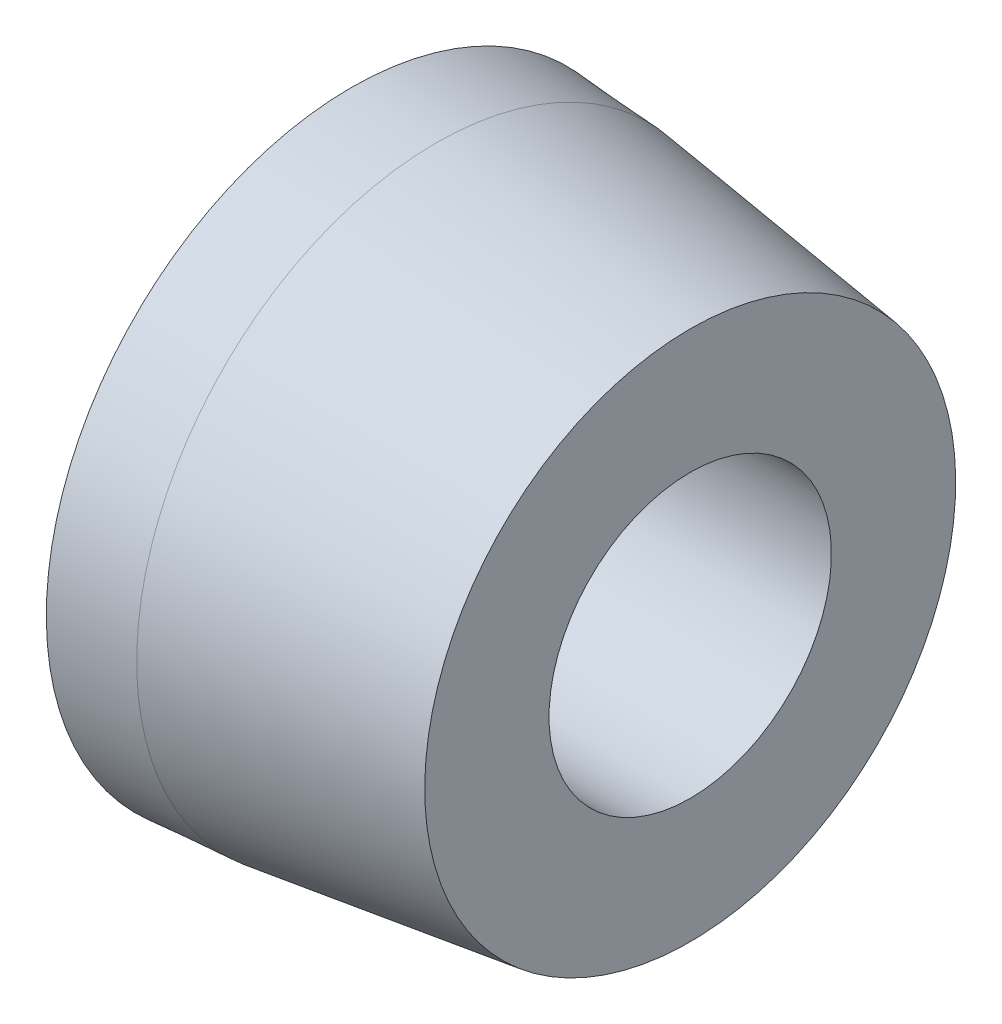
ISO-10303-21;
HEADER;
FILE_DESCRIPTION(('STEP AP214'),'2;1');
FILE_NAME('part.step','',(''),(''),'','','');
FILE_SCHEMA(('AUTOMOTIVE_DESIGN { 1 0 10303 214 1 1 1 1 }'));
ENDSEC;
DATA;
#1=APPLICATION_CONTEXT('core data for automotive mechanical design processes');
#2=APPLICATION_PROTOCOL_DEFINITION('international standard','automotive_design',2000,#1);
#3=PRODUCT_CONTEXT('',#1,'mechanical');
#4=PRODUCT('Part','Part','',(#3));
#5=PRODUCT_RELATED_PRODUCT_CATEGORY('part','',(#4));
#6=PRODUCT_DEFINITION_FORMATION('','',#4);
#7=PRODUCT_DEFINITION_CONTEXT('part definition',#1,'design');
#8=PRODUCT_DEFINITION('design','',#6,#7);
#9=PRODUCT_DEFINITION_SHAPE('','',#8);
#10=(LENGTH_UNIT() NAMED_UNIT(*) SI_UNIT(.MILLI.,.METRE.));
#11=(NAMED_UNIT(*) PLANE_ANGLE_UNIT() SI_UNIT($,.RADIAN.));
#12=(NAMED_UNIT(*) SI_UNIT($,.STERADIAN.) SOLID_ANGLE_UNIT());
#13=UNCERTAINTY_MEASURE_WITH_UNIT(LENGTH_MEASURE(1.E-05),#10,'distance_accuracy_value','');
#14=(GEOMETRIC_REPRESENTATION_CONTEXT(3) GLOBAL_UNCERTAINTY_ASSIGNED_CONTEXT((#13)) GLOBAL_UNIT_ASSIGNED_CONTEXT((#10,
#11,#12)) REPRESENTATION_CONTEXT('',''));
#15=CARTESIAN_POINT('',(0.,0.,0.));
#16=DIRECTION('',(0.,0.,1.));
#17=DIRECTION('',(1.,0.,0.));
#18=AXIS2_PLACEMENT_3D('',#15,#16,#17);
#19=CARTESIAN_POINT('',(0.,0.,0.));
#20=DIRECTION('',(-1.,0.,0.));
#21=DIRECTION('',(0.,0.,1.));
#22=AXIS2_PLACEMENT_3D('',#19,#20,#21);
#23=CYLINDRICAL_SURFACE('',#22,250.);
#24=CARTESIAN_POINT('',(1250.,0.,0.));
#25=DIRECTION('',(-1.,0.,0.));
#26=DIRECTION('',(0.,0.,1.));
#27=AXIS2_PLACEMENT_3D('',#24,#25,#26);
#28=CIRCLE('',#27,250.);
#29=CARTESIAN_POINT('',(1250.,250.,-1.79489651492081E-06));
#30=VERTEX_POINT('',#29);
#31=CARTESIAN_POINT('',(1250.,250.,0.));
#32=VERTEX_POINT('',#31);
#33=EDGE_CURVE('E11',#30,#32,#28,.T.);
#34=ORIENTED_EDGE('',*,*,#33,.T.);
#35=DIRECTION('',(1.,0.,0.));
#36=VECTOR('',#35,1.);
#37=CARTESIAN_POINT('',(1850.,250.,0.));
#38=LINE('',#37,#36);
#39=CARTESIAN_POINT('',(1850.,250.,0.));
#40=VERTEX_POINT('',#39);
#41=EDGE_CURVE('E104',#32,#40,#38,.T.);
#42=ORIENTED_EDGE('',*,*,#41,.T.);
#43=CARTESIAN_POINT('',(1850.,0.,0.));
#44=DIRECTION('',(-1.,0.,0.));
#45=DIRECTION('',(0.,0.,1.));
#46=AXIS2_PLACEMENT_3D('',#43,#44,#45);
#47=CIRCLE('',#46,250.);
#48=CARTESIAN_POINT('',(1850.,250.,-1.79489651492081E-06));
#49=VERTEX_POINT('',#48);
#50=EDGE_CURVE('E82',#49,#40,#47,.T.);
#51=ORIENTED_EDGE('',*,*,#50,.F.);
#52=DIRECTION('',(1.,0.,0.));
#53=VECTOR('',#52,1.);
#54=CARTESIAN_POINT('',(1850.,250.,-1.79489651492081E-06));
#55=LINE('',#54,#53);
#56=EDGE_CURVE('E114',#30,#49,#55,.T.);
#57=ORIENTED_EDGE('',*,*,#56,.F.);
#58=EDGE_LOOP('',(#34,#42,#51,#57));
#59=FACE_BOUND('',#58,.T.);
#60=ADVANCED_FACE('F39',(#59),#23,.F.);
#61=CARTESIAN_POINT('',(1250.,250.,-1.79489651492081E-06));
#62=DIRECTION('',(1.,0.,0.));
#63=DIRECTION('',(0.,0.,-1.));
#64=AXIS2_PLACEMENT_3D('',#61,#62,#63);
#65=PLANE('',#64);
#66=CARTESIAN_POINT('',(1250.,0.,0.));
#67=DIRECTION('',(-1.,0.,0.));
#68=DIRECTION('',(0.,0.,1.));
#69=AXIS2_PLACEMENT_3D('',#66,#67,#68);
#70=CIRCLE('',#69,540.);
#71=CARTESIAN_POINT('',(1250.,540.,-3.87697647222894E-06));
#72=VERTEX_POINT('',#71);
#73=CARTESIAN_POINT('',(1250.,540.,0.));
#74=VERTEX_POINT('',#73);
#75=EDGE_CURVE('E50',#72,#74,#70,.T.);
#76=ORIENTED_EDGE('',*,*,#75,.T.);
#77=DIRECTION('',(0.,-1.,0.));
#78=VECTOR('',#77,1.);
#79=CARTESIAN_POINT('',(1250.,250.,0.));
#80=LINE('',#79,#78);
#81=EDGE_CURVE('E115',#74,#32,#80,.T.);
#82=ORIENTED_EDGE('',*,*,#81,.T.);
#83=ORIENTED_EDGE('',*,*,#33,.F.);
#84=DIRECTION('',(0.,-1.,7.17958605968322E-09));
#85=VECTOR('',#84,1.);
#86=CARTESIAN_POINT('',(1250.,250.,-1.79489651492081E-06));
#87=LINE('',#86,#85);
#88=EDGE_CURVE('E100',#72,#30,#87,.T.);
#89=ORIENTED_EDGE('',*,*,#88,.F.);
#90=EDGE_LOOP('',(#76,#82,#83,#89));
#91=FACE_BOUND('',#90,.T.);
#92=ADVANCED_FACE('F41',(#91),#65,.F.);
#93=CARTESIAN_POINT('',(1400.,0.,0.));
#94=DIRECTION('',(-1.,0.,0.));
#95=DIRECTION('',(0.,0.,1.));
#96=AXIS2_PLACEMENT_3D('',#93,#94,#95);
#97=CONICAL_SURFACE('',#96,530.,0.0665681637758239);
#98=CARTESIAN_POINT('',(1400.,0.,0.));
#99=DIRECTION('',(-1.,0.,0.));
#100=DIRECTION('',(0.,0.,1.));
#101=AXIS2_PLACEMENT_3D('',#98,#99,#100);
#102=CIRCLE('',#101,530.);
#103=CARTESIAN_POINT('',(1400.,530.,-3.80518061163211E-06));
#104=VERTEX_POINT('',#103);
#105=CARTESIAN_POINT('',(1400.,530.,0.));
#106=VERTEX_POINT('',#105);
#107=EDGE_CURVE('E121',#104,#106,#102,.T.);
#108=ORIENTED_EDGE('',*,*,#107,.T.);
#109=DIRECTION('',(-0.997785157856609,0.066519010523774,0.));
#110=VECTOR('',#109,1.);
#111=CARTESIAN_POINT('',(1250.,540.,0.));
#112=LINE('',#111,#110);
#113=EDGE_CURVE('E110',#106,#74,#112,.T.);
#114=ORIENTED_EDGE('',*,*,#113,.T.);
#115=ORIENTED_EDGE('',*,*,#75,.F.);
#116=DIRECTION('',(-0.997785157856609,0.066519010523774,-4.7757896066041E-10));
#117=VECTOR('',#116,1.);
#118=CARTESIAN_POINT('',(1250.,540.,-3.87697647222894E-06));
#119=LINE('',#118,#117);
#120=EDGE_CURVE('E118',#104,#72,#119,.T.);
#121=ORIENTED_EDGE('',*,*,#120,.F.);
#122=EDGE_LOOP('',(#108,#114,#115,#121));
#123=FACE_BOUND('',#122,.T.);
#124=ADVANCED_FACE('F124',(#123),#97,.T.);
#125=CARTESIAN_POINT('',(1850.,0.,0.));
#126=DIRECTION('',(-1.,0.,0.));
#127=DIRECTION('',(0.,0.,1.));
#128=AXIS2_PLACEMENT_3D('',#125,#126,#127);
#129=CONICAL_SURFACE('',#128,470.,0.132551532296674);
#130=CARTESIAN_POINT('',(1850.,0.,0.));
#131=DIRECTION('',(-1.,0.,0.));
#132=DIRECTION('',(0.,0.,1.));
#133=AXIS2_PLACEMENT_3D('',#130,#131,#132);
#134=CIRCLE('',#133,470.);
#135=CARTESIAN_POINT('',(1850.,470.,-3.37440544805111E-06));
#136=VERTEX_POINT('',#135);
#137=CARTESIAN_POINT('',(1850.,470.,0.));
#138=VERTEX_POINT('',#137);
#139=EDGE_CURVE('E96',#136,#138,#134,.T.);
#140=ORIENTED_EDGE('',*,*,#139,.T.);
#141=DIRECTION('',(-0.991227900682635,0.132163720091018,0.));
#142=VECTOR('',#141,1.);
#143=CARTESIAN_POINT('',(1700.,490.,0.));
#144=LINE('',#143,#142);
#145=EDGE_CURVE('E103',#138,#106,#144,.T.);
#146=ORIENTED_EDGE('',*,*,#145,.T.);
#147=ORIENTED_EDGE('',*,*,#107,.F.);
#148=DIRECTION('',(-0.991227900682635,0.132163720091018,-9.48880802361348E-10));
#149=VECTOR('',#148,1.);
#150=CARTESIAN_POINT('',(1700.,490.,-3.51799716924478E-06));
#151=LINE('',#150,#149);
#152=EDGE_CURVE('E117',#136,#104,#151,.T.);
#153=ORIENTED_EDGE('',*,*,#152,.F.);
#154=EDGE_LOOP('',(#140,#146,#147,#153));
#155=FACE_BOUND('',#154,.T.);
#156=ADVANCED_FACE('F129',(#155),#129,.T.);
#157=CARTESIAN_POINT('',(1850.,470.,-3.37440544805111E-06));
#158=DIRECTION('',(-1.,0.,0.));
#159=DIRECTION('',(0.,0.,1.));
#160=AXIS2_PLACEMENT_3D('',#157,#158,#159);
#161=PLANE('',#160);
#162=DIRECTION('',(0.,1.,-7.17958605968322E-09));
#163=VECTOR('',#162,1.);
#164=CARTESIAN_POINT('',(1850.,470.,-3.37440544805111E-06));
#165=LINE('',#164,#163);
#166=EDGE_CURVE('E91',#49,#136,#165,.T.);
#167=ORIENTED_EDGE('',*,*,#166,.F.);
#168=ORIENTED_EDGE('',*,*,#50,.T.);
#169=DIRECTION('',(0.,1.,0.));
#170=VECTOR('',#169,1.);
#171=CARTESIAN_POINT('',(1850.,470.,0.));
#172=LINE('',#171,#170);
#173=EDGE_CURVE('E88',#40,#138,#172,.T.);
#174=ORIENTED_EDGE('',*,*,#173,.T.);
#175=ORIENTED_EDGE('',*,*,#139,.F.);
#176=EDGE_LOOP('',(#167,#168,#174,#175));
#177=FACE_BOUND('',#176,.T.);
#178=ADVANCED_FACE('F90',(#177),#161,.F.);
#179=CARTESIAN_POINT('',(0.,0.,0.));
#180=DIRECTION('',(0.,-7.17958605968322E-09,-1.));
#181=DIRECTION('',(-1.,0.,0.));
#182=AXIS2_PLACEMENT_3D('',#179,#180,#181);
#183=PLANE('',#182);
#184=ORIENTED_EDGE('',*,*,#56,.T.);
#185=ORIENTED_EDGE('',*,*,#166,.T.);
#186=ORIENTED_EDGE('',*,*,#152,.T.);
#187=ORIENTED_EDGE('',*,*,#120,.T.);
#188=ORIENTED_EDGE('',*,*,#88,.T.);
#189=EDGE_LOOP('',(#184,#185,#186,#187,#188));
#190=FACE_BOUND('',#189,.T.);
#191=ADVANCED_FACE('F131',(#190),#183,.F.);
#192=CARTESIAN_POINT('',(0.,0.,0.));
#193=DIRECTION('',(0.,0.,-1.));
#194=DIRECTION('',(-1.,0.,0.));
#195=AXIS2_PLACEMENT_3D('',#192,#193,#194);
#196=PLANE('',#195);
#197=ORIENTED_EDGE('',*,*,#41,.F.);
#198=ORIENTED_EDGE('',*,*,#81,.F.);
#199=ORIENTED_EDGE('',*,*,#113,.F.);
#200=ORIENTED_EDGE('',*,*,#145,.F.);
#201=ORIENTED_EDGE('',*,*,#173,.F.);
#202=EDGE_LOOP('',(#197,#198,#199,#200,#201));
#203=FACE_BOUND('',#202,.T.);
#204=ADVANCED_FACE('F102',(#203),#196,.T.);
#205=CLOSED_SHELL('',(#60,#92,#124,#156,#178,#191,#204));
#206=MANIFOLD_SOLID_BREP('B2',#205);
#207=ADVANCED_BREP_SHAPE_REPRESENTATION('',(#18,#206),#14);
#208=SHAPE_DEFINITION_REPRESENTATION(#9,#207);
ENDSEC;
END-ISO-10303-21;
